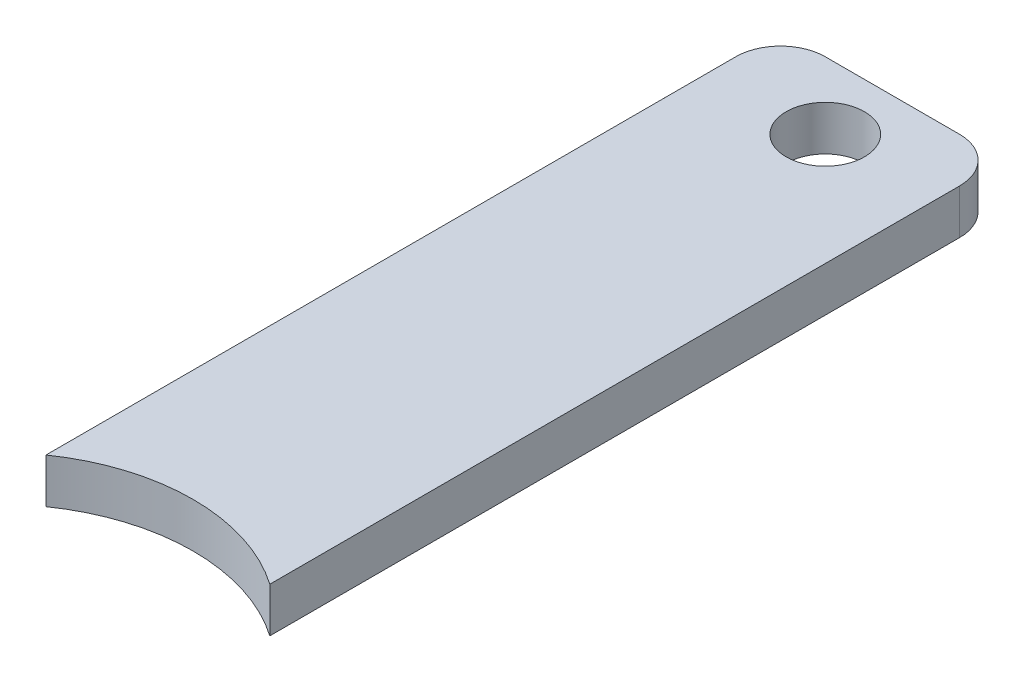
ISO-10303-21;
HEADER;
FILE_DESCRIPTION(('STEP AP214'),'2;1');
FILE_NAME('part.step','',(''),(''),'','','');
FILE_SCHEMA(('AUTOMOTIVE_DESIGN { 1 0 10303 214 1 1 1 1 }'));
ENDSEC;
DATA;
#1=APPLICATION_CONTEXT('core data for automotive mechanical design processes');
#2=APPLICATION_PROTOCOL_DEFINITION('international standard','automotive_design',2000,#1);
#3=PRODUCT_CONTEXT('',#1,'mechanical');
#4=PRODUCT('Part','Part','',(#3));
#5=PRODUCT_RELATED_PRODUCT_CATEGORY('part','',(#4));
#6=PRODUCT_DEFINITION_FORMATION('','',#4);
#7=PRODUCT_DEFINITION_CONTEXT('part definition',#1,'design');
#8=PRODUCT_DEFINITION('design','',#6,#7);
#9=PRODUCT_DEFINITION_SHAPE('','',#8);
#10=(LENGTH_UNIT() NAMED_UNIT(*) SI_UNIT(.MILLI.,.METRE.));
#11=(NAMED_UNIT(*) PLANE_ANGLE_UNIT() SI_UNIT($,.RADIAN.));
#12=(NAMED_UNIT(*) SI_UNIT($,.STERADIAN.) SOLID_ANGLE_UNIT());
#13=UNCERTAINTY_MEASURE_WITH_UNIT(LENGTH_MEASURE(1.E-05),#10,'distance_accuracy_value','');
#14=(GEOMETRIC_REPRESENTATION_CONTEXT(3) GLOBAL_UNCERTAINTY_ASSIGNED_CONTEXT((#13)) GLOBAL_UNIT_ASSIGNED_CONTEXT((#10,
#11,#12)) REPRESENTATION_CONTEXT('',''));
#15=CARTESIAN_POINT('',(0.,0.,0.));
#16=DIRECTION('',(0.,0.,1.));
#17=DIRECTION('',(1.,0.,0.));
#18=AXIS2_PLACEMENT_3D('',#15,#16,#17);
#19=CARTESIAN_POINT('',(0.,4.,0.));
#20=DIRECTION('',(0.,1.,0.));
#21=DIRECTION('',(0.,0.,1.));
#22=AXIS2_PLACEMENT_3D('',#19,#20,#21);
#23=PLANE('',#22);
#24=CARTESIAN_POINT('',(0.,4.,0.));
#25=DIRECTION('',(0.,-1.,0.));
#26=DIRECTION('',(0.,0.,1.));
#27=AXIS2_PLACEMENT_3D('',#24,#25,#26);
#28=CIRCLE('',#27,17.5);
#29=CARTESIAN_POINT('',(-10.,4.,-14.3614066163451));
#30=VERTEX_POINT('',#29);
#31=CARTESIAN_POINT('',(10.,4.,-14.3614066163451));
#32=VERTEX_POINT('',#31);
#33=EDGE_CURVE('E128',#30,#32,#28,.T.);
#34=ORIENTED_EDGE('',*,*,#33,.T.);
#35=DIRECTION('',(0.,0.,-1.));
#36=VECTOR('',#35,1.);
#37=CARTESIAN_POINT('',(10.,4.,-14.3614066163451));
#38=LINE('',#37,#36);
#39=CARTESIAN_POINT('',(10.,4.,-76.));
#40=VERTEX_POINT('',#39);
#41=EDGE_CURVE('E86',#32,#40,#38,.T.);
#42=ORIENTED_EDGE('',*,*,#41,.T.);
#43=CARTESIAN_POINT('',(6.,4.,-76.));
#44=DIRECTION('',(0.,1.,0.));
#45=DIRECTION('',(0.,0.,1.));
#46=AXIS2_PLACEMENT_3D('',#43,#44,#45);
#47=CIRCLE('',#46,4.);
#48=CARTESIAN_POINT('',(5.99999999999997,4.,-80.));
#49=VERTEX_POINT('',#48);
#50=EDGE_CURVE('E99',#40,#49,#47,.T.);
#51=ORIENTED_EDGE('',*,*,#50,.T.);
#52=DIRECTION('',(-1.,0.,0.));
#53=VECTOR('',#52,1.);
#54=CARTESIAN_POINT('',(5.99999999999997,4.,-80.));
#55=LINE('',#54,#53);
#56=CARTESIAN_POINT('',(-6.,4.,-80.));
#57=VERTEX_POINT('',#56);
#58=EDGE_CURVE('E93',#49,#57,#55,.T.);
#59=ORIENTED_EDGE('',*,*,#58,.T.);
#60=CARTESIAN_POINT('',(-6.,4.,-76.));
#61=DIRECTION('',(0.,1.,0.));
#62=DIRECTION('',(0.,0.,-1.));
#63=AXIS2_PLACEMENT_3D('',#60,#61,#62);
#64=CIRCLE('',#63,4.);
#65=CARTESIAN_POINT('',(-10.,4.,-76.));
#66=VERTEX_POINT('',#65);
#67=EDGE_CURVE('E97',#57,#66,#64,.T.);
#68=ORIENTED_EDGE('',*,*,#67,.T.);
#69=DIRECTION('',(0.,0.,1.));
#70=VECTOR('',#69,1.);
#71=CARTESIAN_POINT('',(-10.,4.,-14.3614066163451));
#72=LINE('',#71,#70);
#73=EDGE_CURVE('E49',#66,#30,#72,.T.);
#74=ORIENTED_EDGE('',*,*,#73,.T.);
#75=EDGE_LOOP('',(#34,#42,#51,#59,#68,#74));
#76=FACE_BOUND('',#75,.T.);
#77=CARTESIAN_POINT('',(0.,4.,-74.));
#78=DIRECTION('',(0.,1.,0.));
#79=DIRECTION('',(0.,0.,1.));
#80=AXIS2_PLACEMENT_3D('',#77,#78,#79);
#81=CIRCLE('',#80,3.5);
#82=CARTESIAN_POINT('',(0.,4.,-70.5));
#83=VERTEX_POINT('',#82);
#84=EDGE_CURVE('E121',#83,#83,#81,.T.);
#85=ORIENTED_EDGE('',*,*,#84,.F.);
#86=EDGE_LOOP('',(#85));
#87=FACE_BOUND('',#86,.T.);
#88=ADVANCED_FACE('F32',(#76,#87),#23,.T.);
#89=CARTESIAN_POINT('',(0.,0.,0.));
#90=DIRECTION('',(0.,1.,0.));
#91=DIRECTION('',(0.,0.,1.));
#92=AXIS2_PLACEMENT_3D('',#89,#90,#91);
#93=PLANE('',#92);
#94=CARTESIAN_POINT('',(0.,0.,0.));
#95=DIRECTION('',(0.,-1.,0.));
#96=DIRECTION('',(0.,0.,1.));
#97=AXIS2_PLACEMENT_3D('',#94,#95,#96);
#98=CIRCLE('',#97,17.5);
#99=CARTESIAN_POINT('',(-10.,0.,-14.3614066163451));
#100=VERTEX_POINT('',#99);
#101=CARTESIAN_POINT('',(10.,0.,-14.3614066163451));
#102=VERTEX_POINT('',#101);
#103=EDGE_CURVE('E117',#100,#102,#98,.T.);
#104=ORIENTED_EDGE('',*,*,#103,.F.);
#105=DIRECTION('',(0.,0.,1.));
#106=VECTOR('',#105,1.);
#107=CARTESIAN_POINT('',(-10.,0.,-14.3614066163451));
#108=LINE('',#107,#106);
#109=CARTESIAN_POINT('',(-10.,0.,-76.));
#110=VERTEX_POINT('',#109);
#111=EDGE_CURVE('E78',#110,#100,#108,.T.);
#112=ORIENTED_EDGE('',*,*,#111,.F.);
#113=CARTESIAN_POINT('',(-6.,0.,-76.));
#114=DIRECTION('',(0.,1.,0.));
#115=DIRECTION('',(0.,0.,-1.));
#116=AXIS2_PLACEMENT_3D('',#113,#114,#115);
#117=CIRCLE('',#116,4.);
#118=CARTESIAN_POINT('',(-6.,0.,-80.));
#119=VERTEX_POINT('',#118);
#120=EDGE_CURVE('E72',#119,#110,#117,.T.);
#121=ORIENTED_EDGE('',*,*,#120,.F.);
#122=DIRECTION('',(-1.,0.,0.));
#123=VECTOR('',#122,1.);
#124=CARTESIAN_POINT('',(5.99999999999997,0.,-80.));
#125=LINE('',#124,#123);
#126=CARTESIAN_POINT('',(5.99999999999997,0.,-80.));
#127=VERTEX_POINT('',#126);
#128=EDGE_CURVE('E107',#127,#119,#125,.T.);
#129=ORIENTED_EDGE('',*,*,#128,.F.);
#130=CARTESIAN_POINT('',(6.,0.,-76.));
#131=DIRECTION('',(0.,1.,0.));
#132=DIRECTION('',(0.,0.,1.));
#133=AXIS2_PLACEMENT_3D('',#130,#131,#132);
#134=CIRCLE('',#133,4.);
#135=CARTESIAN_POINT('',(10.,0.,-76.));
#136=VERTEX_POINT('',#135);
#137=EDGE_CURVE('E123',#136,#127,#134,.T.);
#138=ORIENTED_EDGE('',*,*,#137,.F.);
#139=DIRECTION('',(0.,0.,-1.));
#140=VECTOR('',#139,1.);
#141=CARTESIAN_POINT('',(10.,0.,-14.3614066163451));
#142=LINE('',#141,#140);
#143=EDGE_CURVE('E120',#102,#136,#142,.T.);
#144=ORIENTED_EDGE('',*,*,#143,.F.);
#145=EDGE_LOOP('',(#104,#112,#121,#129,#138,#144));
#146=FACE_BOUND('',#145,.T.);
#147=CARTESIAN_POINT('',(0.,0.,-74.));
#148=DIRECTION('',(0.,1.,0.));
#149=DIRECTION('',(0.,0.,1.));
#150=AXIS2_PLACEMENT_3D('',#147,#148,#149);
#151=CIRCLE('',#150,3.5);
#152=CARTESIAN_POINT('',(0.,0.,-70.5));
#153=VERTEX_POINT('',#152);
#154=EDGE_CURVE('E221',#153,#153,#151,.T.);
#155=ORIENTED_EDGE('',*,*,#154,.T.);
#156=EDGE_LOOP('',(#155));
#157=FACE_BOUND('',#156,.T.);
#158=ADVANCED_FACE('F137',(#146,#157),#93,.F.);
#159=CARTESIAN_POINT('',(0.,4.,0.));
#160=DIRECTION('',(0.,-1.,0.));
#161=DIRECTION('',(0.,0.,-1.));
#162=AXIS2_PLACEMENT_3D('',#159,#160,#161);
#163=CYLINDRICAL_SURFACE('',#162,17.5);
#164=ORIENTED_EDGE('',*,*,#103,.T.);
#165=DIRECTION('',(0.,-1.,0.));
#166=VECTOR('',#165,1.);
#167=CARTESIAN_POINT('',(10.,4.,-14.3614066163451));
#168=LINE('',#167,#166);
#169=EDGE_CURVE('E11',#32,#102,#168,.T.);
#170=ORIENTED_EDGE('',*,*,#169,.F.);
#171=ORIENTED_EDGE('',*,*,#33,.F.);
#172=DIRECTION('',(0.,-1.,0.));
#173=VECTOR('',#172,1.);
#174=CARTESIAN_POINT('',(-10.,4.,-14.3614066163451));
#175=LINE('',#174,#173);
#176=EDGE_CURVE('E113',#30,#100,#175,.T.);
#177=ORIENTED_EDGE('',*,*,#176,.T.);
#178=EDGE_LOOP('',(#164,#170,#171,#177));
#179=FACE_BOUND('',#178,.T.);
#180=ADVANCED_FACE('F34',(#179),#163,.F.);
#181=CARTESIAN_POINT('',(10.,4.,-14.3614066163451));
#182=DIRECTION('',(-1.,0.,0.));
#183=DIRECTION('',(0.,0.,1.));
#184=AXIS2_PLACEMENT_3D('',#181,#182,#183);
#185=PLANE('',#184);
#186=ORIENTED_EDGE('',*,*,#143,.T.);
#187=DIRECTION('',(0.,-1.,0.));
#188=VECTOR('',#187,1.);
#189=CARTESIAN_POINT('',(10.,4.,-76.));
#190=LINE('',#189,#188);
#191=EDGE_CURVE('E41',#40,#136,#190,.T.);
#192=ORIENTED_EDGE('',*,*,#191,.F.);
#193=ORIENTED_EDGE('',*,*,#41,.F.);
#194=ORIENTED_EDGE('',*,*,#169,.T.);
#195=EDGE_LOOP('',(#186,#192,#193,#194));
#196=FACE_BOUND('',#195,.T.);
#197=ADVANCED_FACE('F162',(#196),#185,.F.);
#198=CARTESIAN_POINT('',(6.,4.,-76.));
#199=DIRECTION('',(0.,-1.,0.));
#200=DIRECTION('',(0.,0.,-1.));
#201=AXIS2_PLACEMENT_3D('',#198,#199,#200);
#202=CYLINDRICAL_SURFACE('',#201,4.);
#203=ORIENTED_EDGE('',*,*,#137,.T.);
#204=DIRECTION('',(0.,-1.,0.));
#205=VECTOR('',#204,1.);
#206=CARTESIAN_POINT('',(5.99999999999997,4.,-80.));
#207=LINE('',#206,#205);
#208=EDGE_CURVE('E108',#49,#127,#207,.T.);
#209=ORIENTED_EDGE('',*,*,#208,.F.);
#210=ORIENTED_EDGE('',*,*,#50,.F.);
#211=ORIENTED_EDGE('',*,*,#191,.T.);
#212=EDGE_LOOP('',(#203,#209,#210,#211));
#213=FACE_BOUND('',#212,.T.);
#214=ADVANCED_FACE('F134',(#213),#202,.T.);
#215=CARTESIAN_POINT('',(5.99999999999997,4.,-80.));
#216=DIRECTION('',(0.,0.,1.));
#217=DIRECTION('',(1.,0.,0.));
#218=AXIS2_PLACEMENT_3D('',#215,#216,#217);
#219=PLANE('',#218);
#220=ORIENTED_EDGE('',*,*,#128,.T.);
#221=DIRECTION('',(0.,-1.,0.));
#222=VECTOR('',#221,1.);
#223=CARTESIAN_POINT('',(-6.,4.,-80.));
#224=LINE('',#223,#222);
#225=EDGE_CURVE('E104',#57,#119,#224,.T.);
#226=ORIENTED_EDGE('',*,*,#225,.F.);
#227=ORIENTED_EDGE('',*,*,#58,.F.);
#228=ORIENTED_EDGE('',*,*,#208,.T.);
#229=EDGE_LOOP('',(#220,#226,#227,#228));
#230=FACE_BOUND('',#229,.T.);
#231=ADVANCED_FACE('F105',(#230),#219,.F.);
#232=CARTESIAN_POINT('',(-6.,4.,-76.));
#233=DIRECTION('',(0.,-1.,0.));
#234=DIRECTION('',(0.,0.,-1.));
#235=AXIS2_PLACEMENT_3D('',#232,#233,#234);
#236=CYLINDRICAL_SURFACE('',#235,4.);
#237=ORIENTED_EDGE('',*,*,#120,.T.);
#238=DIRECTION('',(0.,-1.,0.));
#239=VECTOR('',#238,1.);
#240=CARTESIAN_POINT('',(-10.,4.,-76.));
#241=LINE('',#240,#239);
#242=EDGE_CURVE('E109',#66,#110,#241,.T.);
#243=ORIENTED_EDGE('',*,*,#242,.F.);
#244=ORIENTED_EDGE('',*,*,#67,.F.);
#245=ORIENTED_EDGE('',*,*,#225,.T.);
#246=EDGE_LOOP('',(#237,#243,#244,#245));
#247=FACE_BOUND('',#246,.T.);
#248=ADVANCED_FACE('F111',(#247),#236,.T.);
#249=CARTESIAN_POINT('',(-10.,4.,-14.3614066163451));
#250=DIRECTION('',(1.,0.,0.));
#251=DIRECTION('',(0.,0.,-1.));
#252=AXIS2_PLACEMENT_3D('',#249,#250,#251);
#253=PLANE('',#252);
#254=ORIENTED_EDGE('',*,*,#111,.T.);
#255=ORIENTED_EDGE('',*,*,#176,.F.);
#256=ORIENTED_EDGE('',*,*,#73,.F.);
#257=ORIENTED_EDGE('',*,*,#242,.T.);
#258=EDGE_LOOP('',(#254,#255,#256,#257));
#259=FACE_BOUND('',#258,.T.);
#260=ADVANCED_FACE('F142',(#259),#253,.F.);
#261=CARTESIAN_POINT('',(0.,4.,-74.));
#262=DIRECTION('',(0.,-1.,0.));
#263=DIRECTION('',(0.,0.,-1.));
#264=AXIS2_PLACEMENT_3D('',#261,#262,#263);
#265=CYLINDRICAL_SURFACE('',#264,3.5);
#266=ORIENTED_EDGE('',*,*,#84,.T.);
#267=EDGE_LOOP('',(#266));
#268=FACE_BOUND('',#267,.T.);
#269=ORIENTED_EDGE('',*,*,#154,.F.);
#270=EDGE_LOOP('',(#269));
#271=FACE_BOUND('',#270,.T.);
#272=ADVANCED_FACE('F144',(#268,#271),#265,.F.);
#273=CLOSED_SHELL('',(#88,#158,#180,#197,#214,#231,#248,#260,#272));
#274=MANIFOLD_SOLID_BREP('B2',#273);
#275=ADVANCED_BREP_SHAPE_REPRESENTATION('',(#18,#274),#14);
#276=SHAPE_DEFINITION_REPRESENTATION(#9,#275);
ENDSEC;
END-ISO-10303-21;
